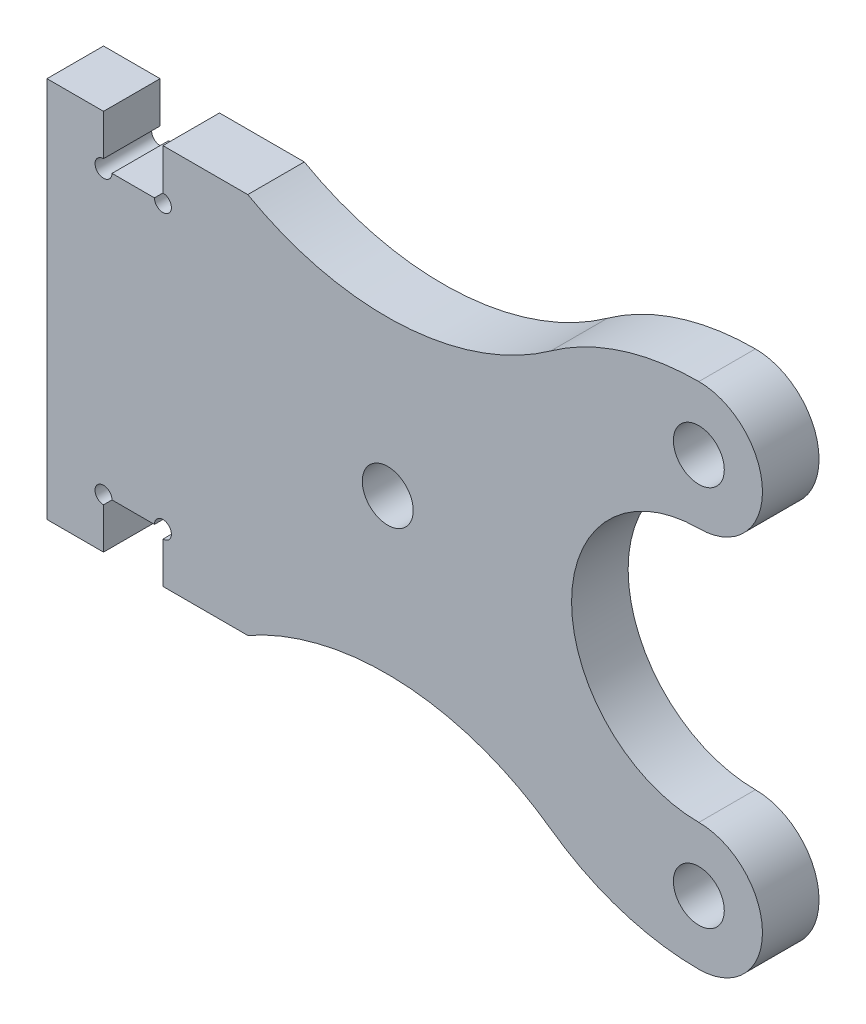
ISO-10303-21;
HEADER;
FILE_DESCRIPTION(('STEP AP214'),'2;1');
FILE_NAME('part.step','',(''),(''),'','','');
FILE_SCHEMA(('AUTOMOTIVE_DESIGN { 1 0 10303 214 1 1 1 1 }'));
ENDSEC;
DATA;
#1=APPLICATION_CONTEXT('core data for automotive mechanical design processes');
#2=APPLICATION_PROTOCOL_DEFINITION('international standard','automotive_design',2000,#1);
#3=PRODUCT_CONTEXT('',#1,'mechanical');
#4=PRODUCT('Part','Part','',(#3));
#5=PRODUCT_RELATED_PRODUCT_CATEGORY('part','',(#4));
#6=PRODUCT_DEFINITION_FORMATION('','',#4);
#7=PRODUCT_DEFINITION_CONTEXT('part definition',#1,'design');
#8=PRODUCT_DEFINITION('design','',#6,#7);
#9=PRODUCT_DEFINITION_SHAPE('','',#8);
#10=(LENGTH_UNIT() NAMED_UNIT(*) SI_UNIT(.MILLI.,.METRE.));
#11=(NAMED_UNIT(*) PLANE_ANGLE_UNIT() SI_UNIT($,.RADIAN.));
#12=(NAMED_UNIT(*) SI_UNIT($,.STERADIAN.) SOLID_ANGLE_UNIT());
#13=UNCERTAINTY_MEASURE_WITH_UNIT(LENGTH_MEASURE(1.E-05),#10,'distance_accuracy_value','');
#14=(GEOMETRIC_REPRESENTATION_CONTEXT(3) GLOBAL_UNCERTAINTY_ASSIGNED_CONTEXT((#13)) GLOBAL_UNIT_ASSIGNED_CONTEXT((#10,
#11,#12)) REPRESENTATION_CONTEXT('',''));
#15=CARTESIAN_POINT('',(0.,0.,0.));
#16=DIRECTION('',(0.,0.,1.));
#17=DIRECTION('',(1.,0.,0.));
#18=AXIS2_PLACEMENT_3D('',#15,#16,#17);
#19=CARTESIAN_POINT('',(-6.04145435688801,-15.4624152603906,2.));
#20=DIRECTION('',(0.,0.,1.));
#21=DIRECTION('',(1.,0.,0.));
#22=AXIS2_PLACEMENT_3D('',#19,#20,#21);
#23=PLANE('',#22);
#24=CARTESIAN_POINT('',(5.,6.75,2.));
#25=DIRECTION('',(0.,0.,1.));
#26=DIRECTION('',(1.,0.,0.));
#27=AXIS2_PLACEMENT_3D('',#24,#25,#26);
#28=CIRCLE('',#27,0.899999999999999);
#29=CARTESIAN_POINT('',(5.9,6.75,2.));
#30=VERTEX_POINT('',#29);
#31=EDGE_CURVE('E417',#30,#30,#28,.T.);
#32=ORIENTED_EDGE('',*,*,#31,.F.);
#33=EDGE_LOOP('',(#32));
#34=FACE_BOUND('',#33,.T.);
#35=DIRECTION('',(1.,0.,0.));
#36=VECTOR('',#35,1.);
#37=CARTESIAN_POINT('',(-13.95,-6.75,2.));
#38=LINE('',#37,#36);
#39=CARTESIAN_POINT('',(-13.95,-6.75,2.));
#40=VERTEX_POINT('',#39);
#41=CARTESIAN_POINT('',(-10.95,-6.75,2.));
#42=VERTEX_POINT('',#41);
#43=EDGE_CURVE('E258',#40,#42,#38,.T.);
#44=ORIENTED_EDGE('',*,*,#43,.T.);
#45=CARTESIAN_POINT('',(-6.04145435688801,-15.4624152603906,2.));
#46=DIRECTION('',(0.,0.,-1.));
#47=DIRECTION('',(1.,0.,0.));
#48=AXIS2_PLACEMENT_3D('',#45,#46,#47);
#49=CIRCLE('',#48,10.);
#50=CARTESIAN_POINT('',(-0.230162590104851,-7.32430196544816,2.));
#51=VERTEX_POINT('',#50);
#52=EDGE_CURVE('E136',#42,#51,#49,.T.);
#53=ORIENTED_EDGE('',*,*,#52,.T.);
#54=CARTESIAN_POINT('',(5.,0.,2.));
#55=DIRECTION('',(0.,0.,1.));
#56=DIRECTION('',(1.,0.,0.));
#57=AXIS2_PLACEMENT_3D('',#54,#55,#56);
#58=CIRCLE('',#57,9.);
#59=CARTESIAN_POINT('',(5.,-9.,2.));
#60=VERTEX_POINT('',#59);
#61=EDGE_CURVE('E315',#51,#60,#58,.T.);
#62=ORIENTED_EDGE('',*,*,#61,.T.);
#63=CARTESIAN_POINT('',(5.,-6.75,2.));
#64=DIRECTION('',(0.,0.,1.));
#65=DIRECTION('',(-1.,0.,0.));
#66=AXIS2_PLACEMENT_3D('',#63,#64,#65);
#67=CIRCLE('',#66,2.25);
#68=CARTESIAN_POINT('',(5.,-4.5,2.));
#69=VERTEX_POINT('',#68);
#70=EDGE_CURVE('E334',#60,#69,#67,.T.);
#71=ORIENTED_EDGE('',*,*,#70,.T.);
#72=CARTESIAN_POINT('',(5.,0.,2.));
#73=DIRECTION('',(0.,0.,-1.));
#74=DIRECTION('',(1.,0.,0.));
#75=AXIS2_PLACEMENT_3D('',#72,#73,#74);
#76=CIRCLE('',#75,4.5);
#77=CARTESIAN_POINT('',(5.,4.5,2.));
#78=VERTEX_POINT('',#77);
#79=EDGE_CURVE('E331',#69,#78,#76,.T.);
#80=ORIENTED_EDGE('',*,*,#79,.T.);
#81=CARTESIAN_POINT('',(5.,6.75,2.));
#82=DIRECTION('',(0.,0.,1.));
#83=DIRECTION('',(-1.,0.,0.));
#84=AXIS2_PLACEMENT_3D('',#81,#82,#83);
#85=CIRCLE('',#84,2.25);
#86=CARTESIAN_POINT('',(5.,9.,2.));
#87=VERTEX_POINT('',#86);
#88=EDGE_CURVE('E333',#78,#87,#85,.T.);
#89=ORIENTED_EDGE('',*,*,#88,.T.);
#90=CARTESIAN_POINT('',(5.,0.,2.));
#91=DIRECTION('',(0.,0.,1.));
#92=DIRECTION('',(1.,0.,0.));
#93=AXIS2_PLACEMENT_3D('',#90,#91,#92);
#94=CIRCLE('',#93,9.);
#95=CARTESIAN_POINT('',(-0.230162590104847,7.32430196544816,2.));
#96=VERTEX_POINT('',#95);
#97=EDGE_CURVE('E336',#87,#96,#94,.T.);
#98=ORIENTED_EDGE('',*,*,#97,.T.);
#99=CARTESIAN_POINT('',(-6.04145435688801,15.4624152603906,2.));
#100=DIRECTION('',(0.,0.,-1.));
#101=DIRECTION('',(1.,0.,0.));
#102=AXIS2_PLACEMENT_3D('',#99,#100,#101);
#103=CIRCLE('',#102,10.);
#104=CARTESIAN_POINT('',(-10.95,6.75,2.));
#105=VERTEX_POINT('',#104);
#106=EDGE_CURVE('E342',#96,#105,#103,.T.);
#107=ORIENTED_EDGE('',*,*,#106,.T.);
#108=DIRECTION('',(-1.,0.,0.));
#109=VECTOR('',#108,1.);
#110=CARTESIAN_POINT('',(-10.95,6.75,2.));
#111=LINE('',#110,#109);
#112=CARTESIAN_POINT('',(-13.95,6.75,2.));
#113=VERTEX_POINT('',#112);
#114=EDGE_CURVE('E344',#105,#113,#111,.T.);
#115=ORIENTED_EDGE('',*,*,#114,.T.);
#116=DIRECTION('',(0.,-1.,0.));
#117=VECTOR('',#116,1.);
#118=CARTESIAN_POINT('',(-13.95,6.75,2.));
#119=LINE('',#118,#117);
#120=CARTESIAN_POINT('',(-13.95,5.29999855515279,2.));
#121=VERTEX_POINT('',#120);
#122=EDGE_CURVE('E346',#113,#121,#119,.T.);
#123=ORIENTED_EDGE('',*,*,#122,.T.);
#124=CARTESIAN_POINT('',(-13.95,4.99999855515279,2.));
#125=DIRECTION('',(0.,0.,-1.));
#126=DIRECTION('',(1.,0.,0.));
#127=AXIS2_PLACEMENT_3D('',#124,#125,#126);
#128=CIRCLE('',#127,0.3);
#129=CARTESIAN_POINT('',(-14.25,4.99999855515279,2.));
#130=VERTEX_POINT('',#129);
#131=EDGE_CURVE('E348',#121,#130,#128,.T.);
#132=ORIENTED_EDGE('',*,*,#131,.T.);
#133=DIRECTION('',(-1.,0.,0.));
#134=VECTOR('',#133,1.);
#135=CARTESIAN_POINT('',(-14.25,4.99999855515279,2.));
#136=LINE('',#135,#134);
#137=CARTESIAN_POINT('',(-15.75,4.99999855515279,2.));
#138=VERTEX_POINT('',#137);
#139=EDGE_CURVE('E350',#130,#138,#136,.T.);
#140=ORIENTED_EDGE('',*,*,#139,.T.);
#141=CARTESIAN_POINT('',(-16.05,4.99999855515279,2.));
#142=DIRECTION('',(0.,0.,-1.));
#143=DIRECTION('',(1.,0.,0.));
#144=AXIS2_PLACEMENT_3D('',#141,#142,#143);
#145=CIRCLE('',#144,0.300000000000001);
#146=CARTESIAN_POINT('',(-16.05,5.29999855515279,2.));
#147=VERTEX_POINT('',#146);
#148=EDGE_CURVE('E352',#138,#147,#145,.T.);
#149=ORIENTED_EDGE('',*,*,#148,.T.);
#150=DIRECTION('',(0.,1.,0.));
#151=VECTOR('',#150,1.);
#152=CARTESIAN_POINT('',(-16.05,5.29999855515279,2.));
#153=LINE('',#152,#151);
#154=CARTESIAN_POINT('',(-16.05,6.75,2.));
#155=VERTEX_POINT('',#154);
#156=EDGE_CURVE('E354',#147,#155,#153,.T.);
#157=ORIENTED_EDGE('',*,*,#156,.T.);
#158=DIRECTION('',(-1.,0.,0.));
#159=VECTOR('',#158,1.);
#160=CARTESIAN_POINT('',(-16.05,6.75,2.));
#161=LINE('',#160,#159);
#162=CARTESIAN_POINT('',(-18.05,6.75,2.));
#163=VERTEX_POINT('',#162);
#164=EDGE_CURVE('E356',#155,#163,#161,.T.);
#165=ORIENTED_EDGE('',*,*,#164,.T.);
#166=DIRECTION('',(0.,-1.,0.));
#167=VECTOR('',#166,1.);
#168=CARTESIAN_POINT('',(-18.05,6.75,2.));
#169=LINE('',#168,#167);
#170=CARTESIAN_POINT('',(-18.05,-6.75,2.));
#171=VERTEX_POINT('',#170);
#172=EDGE_CURVE('E358',#163,#171,#169,.T.);
#173=ORIENTED_EDGE('',*,*,#172,.T.);
#174=DIRECTION('',(1.,0.,0.));
#175=VECTOR('',#174,1.);
#176=CARTESIAN_POINT('',(-18.05,-6.75,2.));
#177=LINE('',#176,#175);
#178=CARTESIAN_POINT('',(-16.05,-6.75,2.));
#179=VERTEX_POINT('',#178);
#180=EDGE_CURVE('E360',#171,#179,#177,.T.);
#181=ORIENTED_EDGE('',*,*,#180,.T.);
#182=DIRECTION('',(0.,1.,0.));
#183=VECTOR('',#182,1.);
#184=CARTESIAN_POINT('',(-16.05,-6.75,2.));
#185=LINE('',#184,#183);
#186=CARTESIAN_POINT('',(-16.05,-5.29999855515279,2.));
#187=VERTEX_POINT('',#186);
#188=EDGE_CURVE('E362',#179,#187,#185,.T.);
#189=ORIENTED_EDGE('',*,*,#188,.T.);
#190=CARTESIAN_POINT('',(-16.05,-4.99999855515279,2.));
#191=DIRECTION('',(0.,0.,-1.));
#192=DIRECTION('',(1.,0.,0.));
#193=AXIS2_PLACEMENT_3D('',#190,#191,#192);
#194=CIRCLE('',#193,0.3);
#195=CARTESIAN_POINT('',(-15.75,-4.99999855515279,2.));
#196=VERTEX_POINT('',#195);
#197=EDGE_CURVE('E197',#187,#196,#194,.T.);
#198=ORIENTED_EDGE('',*,*,#197,.T.);
#199=DIRECTION('',(1.,0.,0.));
#200=VECTOR('',#199,1.);
#201=CARTESIAN_POINT('',(-15.75,-4.99999855515279,2.));
#202=LINE('',#201,#200);
#203=CARTESIAN_POINT('',(-14.25,-4.99999855515279,2.));
#204=VERTEX_POINT('',#203);
#205=EDGE_CURVE('E191',#196,#204,#202,.T.);
#206=ORIENTED_EDGE('',*,*,#205,.T.);
#207=CARTESIAN_POINT('',(-13.95,-4.99999855515279,2.));
#208=DIRECTION('',(0.,0.,-1.));
#209=DIRECTION('',(1.,0.,0.));
#210=AXIS2_PLACEMENT_3D('',#207,#208,#209);
#211=CIRCLE('',#210,0.3);
#212=CARTESIAN_POINT('',(-13.95,-5.29999855515279,2.));
#213=VERTEX_POINT('',#212);
#214=EDGE_CURVE('E195',#204,#213,#211,.T.);
#215=ORIENTED_EDGE('',*,*,#214,.T.);
#216=DIRECTION('',(0.,-1.,0.));
#217=VECTOR('',#216,1.);
#218=CARTESIAN_POINT('',(-13.95,-5.29999855515279,2.));
#219=LINE('',#218,#217);
#220=EDGE_CURVE('E51',#213,#40,#219,.T.);
#221=ORIENTED_EDGE('',*,*,#220,.T.);
#222=EDGE_LOOP('',(#44,#53,#62,#71,#80,#89,#98,#107,#115,#123,#132,#140,#149,#157,#165,#173,
#181,#189,#198,#206,#215,#221));
#223=FACE_BOUND('',#222,.T.);
#224=CARTESIAN_POINT('',(-6.,0.,2.));
#225=DIRECTION('',(0.,0.,1.));
#226=DIRECTION('',(1.,0.,0.));
#227=AXIS2_PLACEMENT_3D('',#224,#225,#226);
#228=CIRCLE('',#227,0.899999999999999);
#229=CARTESIAN_POINT('',(-5.1,0.,2.));
#230=VERTEX_POINT('',#229);
#231=EDGE_CURVE('E219',#230,#230,#228,.T.);
#232=ORIENTED_EDGE('',*,*,#231,.F.);
#233=EDGE_LOOP('',(#232));
#234=FACE_BOUND('',#233,.T.);
#235=CARTESIAN_POINT('',(5.,-6.75,2.));
#236=DIRECTION('',(0.,0.,1.));
#237=DIRECTION('',(1.,0.,0.));
#238=AXIS2_PLACEMENT_3D('',#235,#236,#237);
#239=CIRCLE('',#238,0.899999999999999);
#240=CARTESIAN_POINT('',(5.9,-6.75,2.));
#241=VERTEX_POINT('',#240);
#242=EDGE_CURVE('E408',#241,#241,#239,.T.);
#243=ORIENTED_EDGE('',*,*,#242,.F.);
#244=EDGE_LOOP('',(#243));
#245=FACE_BOUND('',#244,.T.);
#246=ADVANCED_FACE('F34',(#34,#223,#234,#245),#23,.T.);
#247=CARTESIAN_POINT('',(-6.04145435688801,-15.4624152603906,0.));
#248=DIRECTION('',(0.,0.,1.));
#249=DIRECTION('',(1.,0.,0.));
#250=AXIS2_PLACEMENT_3D('',#247,#248,#249);
#251=PLANE('',#250);
#252=DIRECTION('',(1.,0.,0.));
#253=VECTOR('',#252,1.);
#254=CARTESIAN_POINT('',(-13.95,-6.75,0.));
#255=LINE('',#254,#253);
#256=CARTESIAN_POINT('',(-13.95,-6.75,0.));
#257=VERTEX_POINT('',#256);
#258=CARTESIAN_POINT('',(-10.95,-6.75,0.));
#259=VERTEX_POINT('',#258);
#260=EDGE_CURVE('E215',#257,#259,#255,.T.);
#261=ORIENTED_EDGE('',*,*,#260,.F.);
#262=DIRECTION('',(0.,-1.,0.));
#263=VECTOR('',#262,1.);
#264=CARTESIAN_POINT('',(-13.95,-5.29999855515279,0.));
#265=LINE('',#264,#263);
#266=CARTESIAN_POINT('',(-13.95,-5.29999855515279,0.));
#267=VERTEX_POINT('',#266);
#268=EDGE_CURVE('E128',#267,#257,#265,.T.);
#269=ORIENTED_EDGE('',*,*,#268,.F.);
#270=CARTESIAN_POINT('',(-13.95,-4.99999855515279,0.));
#271=DIRECTION('',(0.,0.,-1.));
#272=DIRECTION('',(1.,0.,0.));
#273=AXIS2_PLACEMENT_3D('',#270,#271,#272);
#274=CIRCLE('',#273,0.3);
#275=CARTESIAN_POINT('',(-14.25,-4.99999855515279,0.));
#276=VERTEX_POINT('',#275);
#277=EDGE_CURVE('E122',#276,#267,#274,.T.);
#278=ORIENTED_EDGE('',*,*,#277,.F.);
#279=DIRECTION('',(1.,0.,0.));
#280=VECTOR('',#279,1.);
#281=CARTESIAN_POINT('',(-15.75,-4.99999855515279,0.));
#282=LINE('',#281,#280);
#283=CARTESIAN_POINT('',(-15.75,-4.99999855515279,0.));
#284=VERTEX_POINT('',#283);
#285=EDGE_CURVE('E205',#284,#276,#282,.T.);
#286=ORIENTED_EDGE('',*,*,#285,.F.);
#287=CARTESIAN_POINT('',(-16.05,-4.99999855515279,0.));
#288=DIRECTION('',(0.,0.,-1.));
#289=DIRECTION('',(1.,0.,0.));
#290=AXIS2_PLACEMENT_3D('',#287,#288,#289);
#291=CIRCLE('',#290,0.3);
#292=CARTESIAN_POINT('',(-16.05,-5.29999855515279,0.));
#293=VERTEX_POINT('',#292);
#294=EDGE_CURVE('E253',#293,#284,#291,.T.);
#295=ORIENTED_EDGE('',*,*,#294,.F.);
#296=DIRECTION('',(0.,1.,0.));
#297=VECTOR('',#296,1.);
#298=CARTESIAN_POINT('',(-16.05,-6.75,0.));
#299=LINE('',#298,#297);
#300=CARTESIAN_POINT('',(-16.05,-6.75,0.));
#301=VERTEX_POINT('',#300);
#302=EDGE_CURVE('E251',#301,#293,#299,.T.);
#303=ORIENTED_EDGE('',*,*,#302,.F.);
#304=DIRECTION('',(1.,0.,0.));
#305=VECTOR('',#304,1.);
#306=CARTESIAN_POINT('',(-18.05,-6.75,0.));
#307=LINE('',#306,#305);
#308=CARTESIAN_POINT('',(-18.05,-6.75,0.));
#309=VERTEX_POINT('',#308);
#310=EDGE_CURVE('E249',#309,#301,#307,.T.);
#311=ORIENTED_EDGE('',*,*,#310,.F.);
#312=DIRECTION('',(0.,-1.,0.));
#313=VECTOR('',#312,1.);
#314=CARTESIAN_POINT('',(-18.05,6.75,0.));
#315=LINE('',#314,#313);
#316=CARTESIAN_POINT('',(-18.05,6.75,0.));
#317=VERTEX_POINT('',#316);
#318=EDGE_CURVE('E247',#317,#309,#315,.T.);
#319=ORIENTED_EDGE('',*,*,#318,.F.);
#320=DIRECTION('',(-1.,0.,0.));
#321=VECTOR('',#320,1.);
#322=CARTESIAN_POINT('',(-16.05,6.75,0.));
#323=LINE('',#322,#321);
#324=CARTESIAN_POINT('',(-16.05,6.75,0.));
#325=VERTEX_POINT('',#324);
#326=EDGE_CURVE('E245',#325,#317,#323,.T.);
#327=ORIENTED_EDGE('',*,*,#326,.F.);
#328=DIRECTION('',(0.,1.,0.));
#329=VECTOR('',#328,1.);
#330=CARTESIAN_POINT('',(-16.05,5.29999855515279,0.));
#331=LINE('',#330,#329);
#332=CARTESIAN_POINT('',(-16.05,5.29999855515279,0.));
#333=VERTEX_POINT('',#332);
#334=EDGE_CURVE('E243',#333,#325,#331,.T.);
#335=ORIENTED_EDGE('',*,*,#334,.F.);
#336=CARTESIAN_POINT('',(-16.05,4.99999855515279,0.));
#337=DIRECTION('',(0.,0.,-1.));
#338=DIRECTION('',(1.,0.,0.));
#339=AXIS2_PLACEMENT_3D('',#336,#337,#338);
#340=CIRCLE('',#339,0.300000000000001);
#341=CARTESIAN_POINT('',(-15.75,4.99999855515279,0.));
#342=VERTEX_POINT('',#341);
#343=EDGE_CURVE('E241',#342,#333,#340,.T.);
#344=ORIENTED_EDGE('',*,*,#343,.F.);
#345=DIRECTION('',(-1.,0.,0.));
#346=VECTOR('',#345,1.);
#347=CARTESIAN_POINT('',(-14.25,4.99999855515279,0.));
#348=LINE('',#347,#346);
#349=CARTESIAN_POINT('',(-14.25,4.99999855515279,0.));
#350=VERTEX_POINT('',#349);
#351=EDGE_CURVE('E239',#350,#342,#348,.T.);
#352=ORIENTED_EDGE('',*,*,#351,.F.);
#353=CARTESIAN_POINT('',(-13.95,4.99999855515279,0.));
#354=DIRECTION('',(0.,0.,-1.));
#355=DIRECTION('',(1.,0.,0.));
#356=AXIS2_PLACEMENT_3D('',#353,#354,#355);
#357=CIRCLE('',#356,0.3);
#358=CARTESIAN_POINT('',(-13.95,5.29999855515279,0.));
#359=VERTEX_POINT('',#358);
#360=EDGE_CURVE('E237',#359,#350,#357,.T.);
#361=ORIENTED_EDGE('',*,*,#360,.F.);
#362=DIRECTION('',(0.,-1.,0.));
#363=VECTOR('',#362,1.);
#364=CARTESIAN_POINT('',(-13.95,6.75,0.));
#365=LINE('',#364,#363);
#366=CARTESIAN_POINT('',(-13.95,6.75,0.));
#367=VERTEX_POINT('',#366);
#368=EDGE_CURVE('E235',#367,#359,#365,.T.);
#369=ORIENTED_EDGE('',*,*,#368,.F.);
#370=DIRECTION('',(-1.,0.,0.));
#371=VECTOR('',#370,1.);
#372=CARTESIAN_POINT('',(-10.95,6.75,0.));
#373=LINE('',#372,#371);
#374=CARTESIAN_POINT('',(-10.95,6.75,0.));
#375=VERTEX_POINT('',#374);
#376=EDGE_CURVE('E233',#375,#367,#373,.T.);
#377=ORIENTED_EDGE('',*,*,#376,.F.);
#378=CARTESIAN_POINT('',(-6.04145435688801,15.4624152603906,0.));
#379=DIRECTION('',(0.,0.,-1.));
#380=DIRECTION('',(1.,0.,0.));
#381=AXIS2_PLACEMENT_3D('',#378,#379,#380);
#382=CIRCLE('',#381,10.);
#383=CARTESIAN_POINT('',(-0.230162590104847,7.32430196544816,0.));
#384=VERTEX_POINT('',#383);
#385=EDGE_CURVE('E231',#384,#375,#382,.T.);
#386=ORIENTED_EDGE('',*,*,#385,.F.);
#387=CARTESIAN_POINT('',(5.,0.,0.));
#388=DIRECTION('',(0.,0.,1.));
#389=DIRECTION('',(1.,0.,0.));
#390=AXIS2_PLACEMENT_3D('',#387,#388,#389);
#391=CIRCLE('',#390,9.);
#392=CARTESIAN_POINT('',(5.,9.,0.));
#393=VERTEX_POINT('',#392);
#394=EDGE_CURVE('E229',#393,#384,#391,.T.);
#395=ORIENTED_EDGE('',*,*,#394,.F.);
#396=CARTESIAN_POINT('',(5.,6.75,0.));
#397=DIRECTION('',(0.,0.,1.));
#398=DIRECTION('',(-1.,0.,0.));
#399=AXIS2_PLACEMENT_3D('',#396,#397,#398);
#400=CIRCLE('',#399,2.25);
#401=CARTESIAN_POINT('',(5.,4.5,0.));
#402=VERTEX_POINT('',#401);
#403=EDGE_CURVE('E227',#402,#393,#400,.T.);
#404=ORIENTED_EDGE('',*,*,#403,.F.);
#405=CARTESIAN_POINT('',(5.,0.,0.));
#406=DIRECTION('',(0.,0.,-1.));
#407=DIRECTION('',(1.,0.,0.));
#408=AXIS2_PLACEMENT_3D('',#405,#406,#407);
#409=CIRCLE('',#408,4.5);
#410=CARTESIAN_POINT('',(5.,-4.5,0.));
#411=VERTEX_POINT('',#410);
#412=EDGE_CURVE('E225',#411,#402,#409,.T.);
#413=ORIENTED_EDGE('',*,*,#412,.F.);
#414=CARTESIAN_POINT('',(5.,-6.75,0.));
#415=DIRECTION('',(0.,0.,1.));
#416=DIRECTION('',(-1.,0.,0.));
#417=AXIS2_PLACEMENT_3D('',#414,#415,#416);
#418=CIRCLE('',#417,2.25);
#419=CARTESIAN_POINT('',(5.,-9.,0.));
#420=VERTEX_POINT('',#419);
#421=EDGE_CURVE('E223',#420,#411,#418,.T.);
#422=ORIENTED_EDGE('',*,*,#421,.F.);
#423=CARTESIAN_POINT('',(5.,0.,0.));
#424=DIRECTION('',(0.,0.,1.));
#425=DIRECTION('',(1.,0.,0.));
#426=AXIS2_PLACEMENT_3D('',#423,#424,#425);
#427=CIRCLE('',#426,9.);
#428=CARTESIAN_POINT('',(-0.230162590104851,-7.32430196544816,0.));
#429=VERTEX_POINT('',#428);
#430=EDGE_CURVE('E221',#429,#420,#427,.T.);
#431=ORIENTED_EDGE('',*,*,#430,.F.);
#432=CARTESIAN_POINT('',(-6.04145435688801,-15.4624152603906,0.));
#433=DIRECTION('',(0.,0.,-1.));
#434=DIRECTION('',(1.,0.,0.));
#435=AXIS2_PLACEMENT_3D('',#432,#433,#434);
#436=CIRCLE('',#435,10.);
#437=EDGE_CURVE('E218',#259,#429,#436,.T.);
#438=ORIENTED_EDGE('',*,*,#437,.F.);
#439=EDGE_LOOP('',(#261,#269,#278,#286,#295,#303,#311,#319,#327,#335,#344,#352,#361,#369,#377,
#386,#395,#404,#413,#422,#431,#438));
#440=FACE_BOUND('',#439,.T.);
#441=CARTESIAN_POINT('',(-6.,0.,0.));
#442=DIRECTION('',(0.,0.,1.));
#443=DIRECTION('',(1.,0.,0.));
#444=AXIS2_PLACEMENT_3D('',#441,#442,#443);
#445=CIRCLE('',#444,0.899999999999999);
#446=CARTESIAN_POINT('',(-5.1,0.,0.));
#447=VERTEX_POINT('',#446);
#448=EDGE_CURVE('E420',#447,#447,#445,.T.);
#449=ORIENTED_EDGE('',*,*,#448,.T.);
#450=EDGE_LOOP('',(#449));
#451=FACE_BOUND('',#450,.T.);
#452=CARTESIAN_POINT('',(5.,6.75,0.));
#453=DIRECTION('',(0.,0.,1.));
#454=DIRECTION('',(1.,0.,0.));
#455=AXIS2_PLACEMENT_3D('',#452,#453,#454);
#456=CIRCLE('',#455,0.899999999999999);
#457=CARTESIAN_POINT('',(5.9,6.75,0.));
#458=VERTEX_POINT('',#457);
#459=EDGE_CURVE('E414',#458,#458,#456,.T.);
#460=ORIENTED_EDGE('',*,*,#459,.T.);
#461=EDGE_LOOP('',(#460));
#462=FACE_BOUND('',#461,.T.);
#463=CARTESIAN_POINT('',(5.,-6.75,0.));
#464=DIRECTION('',(0.,0.,1.));
#465=DIRECTION('',(1.,0.,0.));
#466=AXIS2_PLACEMENT_3D('',#463,#464,#465);
#467=CIRCLE('',#466,0.899999999999999);
#468=CARTESIAN_POINT('',(5.9,-6.75,0.));
#469=VERTEX_POINT('',#468);
#470=EDGE_CURVE('E411',#469,#469,#467,.T.);
#471=ORIENTED_EDGE('',*,*,#470,.T.);
#472=EDGE_LOOP('',(#471));
#473=FACE_BOUND('',#472,.T.);
#474=ADVANCED_FACE('F319',(#440,#451,#462,#473),#251,.F.);
#475=CARTESIAN_POINT('',(-13.95,-6.75,2.));
#476=DIRECTION('',(0.,1.,0.));
#477=DIRECTION('',(-1.,0.,0.));
#478=AXIS2_PLACEMENT_3D('',#475,#476,#477);
#479=PLANE('',#478);
#480=ORIENTED_EDGE('',*,*,#260,.T.);
#481=DIRECTION('',(0.,0.,-1.));
#482=VECTOR('',#481,1.);
#483=CARTESIAN_POINT('',(-10.95,-6.75,2.));
#484=LINE('',#483,#482);
#485=EDGE_CURVE('E11',#42,#259,#484,.T.);
#486=ORIENTED_EDGE('',*,*,#485,.F.);
#487=ORIENTED_EDGE('',*,*,#43,.F.);
#488=DIRECTION('',(0.,0.,-1.));
#489=VECTOR('',#488,1.);
#490=CARTESIAN_POINT('',(-13.95,-6.75,2.));
#491=LINE('',#490,#489);
#492=EDGE_CURVE('E211',#40,#257,#491,.T.);
#493=ORIENTED_EDGE('',*,*,#492,.T.);
#494=EDGE_LOOP('',(#480,#486,#487,#493));
#495=FACE_BOUND('',#494,.T.);
#496=ADVANCED_FACE('F36',(#495),#479,.F.);
#497=CARTESIAN_POINT('',(-6.04145435688801,-15.4624152603906,2.));
#498=DIRECTION('',(0.,0.,-1.));
#499=DIRECTION('',(-1.,0.,0.));
#500=AXIS2_PLACEMENT_3D('',#497,#498,#499);
#501=CYLINDRICAL_SURFACE('',#500,10.);
#502=ORIENTED_EDGE('',*,*,#437,.T.);
#503=DIRECTION('',(0.,0.,-1.));
#504=VECTOR('',#503,1.);
#505=CARTESIAN_POINT('',(-0.230162590104851,-7.32430196544816,2.));
#506=LINE('',#505,#504);
#507=EDGE_CURVE('E43',#51,#429,#506,.T.);
#508=ORIENTED_EDGE('',*,*,#507,.F.);
#509=ORIENTED_EDGE('',*,*,#52,.F.);
#510=ORIENTED_EDGE('',*,*,#485,.T.);
#511=EDGE_LOOP('',(#502,#508,#509,#510));
#512=FACE_BOUND('',#511,.T.);
#513=ADVANCED_FACE('F622',(#512),#501,.F.);
#514=CARTESIAN_POINT('',(5.,0.,2.));
#515=DIRECTION('',(0.,0.,-1.));
#516=DIRECTION('',(-1.,0.,0.));
#517=AXIS2_PLACEMENT_3D('',#514,#515,#516);
#518=CYLINDRICAL_SURFACE('',#517,9.);
#519=ORIENTED_EDGE('',*,*,#430,.T.);
#520=DIRECTION('',(0.,0.,-1.));
#521=VECTOR('',#520,1.);
#522=CARTESIAN_POINT('',(5.,-9.,2.));
#523=LINE('',#522,#521);
#524=EDGE_CURVE('E307',#60,#420,#523,.T.);
#525=ORIENTED_EDGE('',*,*,#524,.F.);
#526=ORIENTED_EDGE('',*,*,#61,.F.);
#527=ORIENTED_EDGE('',*,*,#507,.T.);
#528=EDGE_LOOP('',(#519,#525,#526,#527));
#529=FACE_BOUND('',#528,.T.);
#530=ADVANCED_FACE('F313',(#529),#518,.T.);
#531=CARTESIAN_POINT('',(5.,-6.75,2.));
#532=DIRECTION('',(0.,0.,-1.));
#533=DIRECTION('',(-1.,0.,0.));
#534=AXIS2_PLACEMENT_3D('',#531,#532,#533);
#535=CYLINDRICAL_SURFACE('',#534,2.25);
#536=ORIENTED_EDGE('',*,*,#421,.T.);
#537=DIRECTION('',(0.,0.,-1.));
#538=VECTOR('',#537,1.);
#539=CARTESIAN_POINT('',(5.,-4.5,2.));
#540=LINE('',#539,#538);
#541=EDGE_CURVE('E304',#69,#411,#540,.T.);
#542=ORIENTED_EDGE('',*,*,#541,.F.);
#543=ORIENTED_EDGE('',*,*,#70,.F.);
#544=ORIENTED_EDGE('',*,*,#524,.T.);
#545=EDGE_LOOP('',(#536,#542,#543,#544));
#546=FACE_BOUND('',#545,.T.);
#547=ADVANCED_FACE('F325',(#546),#535,.T.);
#548=CARTESIAN_POINT('',(5.,0.,2.));
#549=DIRECTION('',(0.,0.,-1.));
#550=DIRECTION('',(-1.,0.,0.));
#551=AXIS2_PLACEMENT_3D('',#548,#549,#550);
#552=CYLINDRICAL_SURFACE('',#551,4.5);
#553=ORIENTED_EDGE('',*,*,#412,.T.);
#554=DIRECTION('',(0.,0.,-1.));
#555=VECTOR('',#554,1.);
#556=CARTESIAN_POINT('',(5.,4.5,2.));
#557=LINE('',#556,#555);
#558=EDGE_CURVE('E301',#78,#402,#557,.T.);
#559=ORIENTED_EDGE('',*,*,#558,.F.);
#560=ORIENTED_EDGE('',*,*,#79,.F.);
#561=ORIENTED_EDGE('',*,*,#541,.T.);
#562=EDGE_LOOP('',(#553,#559,#560,#561));
#563=FACE_BOUND('',#562,.T.);
#564=ADVANCED_FACE('F329',(#563),#552,.F.);
#565=CARTESIAN_POINT('',(5.,6.75,2.));
#566=DIRECTION('',(0.,0.,-1.));
#567=DIRECTION('',(-1.,0.,0.));
#568=AXIS2_PLACEMENT_3D('',#565,#566,#567);
#569=CYLINDRICAL_SURFACE('',#568,2.25);
#570=ORIENTED_EDGE('',*,*,#403,.T.);
#571=DIRECTION('',(0.,0.,-1.));
#572=VECTOR('',#571,1.);
#573=CARTESIAN_POINT('',(5.,9.,2.));
#574=LINE('',#573,#572);
#575=EDGE_CURVE('E298',#87,#393,#574,.T.);
#576=ORIENTED_EDGE('',*,*,#575,.F.);
#577=ORIENTED_EDGE('',*,*,#88,.F.);
#578=ORIENTED_EDGE('',*,*,#558,.T.);
#579=EDGE_LOOP('',(#570,#576,#577,#578));
#580=FACE_BOUND('',#579,.T.);
#581=ADVANCED_FACE('F587',(#580),#569,.T.);
#582=CARTESIAN_POINT('',(5.,0.,2.));
#583=DIRECTION('',(0.,0.,-1.));
#584=DIRECTION('',(-1.,0.,0.));
#585=AXIS2_PLACEMENT_3D('',#582,#583,#584);
#586=CYLINDRICAL_SURFACE('',#585,9.);
#587=ORIENTED_EDGE('',*,*,#394,.T.);
#588=DIRECTION('',(0.,0.,-1.));
#589=VECTOR('',#588,1.);
#590=CARTESIAN_POINT('',(-0.230162590104847,7.32430196544816,2.));
#591=LINE('',#590,#589);
#592=EDGE_CURVE('E295',#96,#384,#591,.T.);
#593=ORIENTED_EDGE('',*,*,#592,.F.);
#594=ORIENTED_EDGE('',*,*,#97,.F.);
#595=ORIENTED_EDGE('',*,*,#575,.T.);
#596=EDGE_LOOP('',(#587,#593,#594,#595));
#597=FACE_BOUND('',#596,.T.);
#598=ADVANCED_FACE('F577',(#597),#586,.T.);
#599=CARTESIAN_POINT('',(-6.04145435688801,15.4624152603906,2.));
#600=DIRECTION('',(0.,0.,-1.));
#601=DIRECTION('',(-1.,0.,0.));
#602=AXIS2_PLACEMENT_3D('',#599,#600,#601);
#603=CYLINDRICAL_SURFACE('',#602,10.);
#604=ORIENTED_EDGE('',*,*,#385,.T.);
#605=DIRECTION('',(0.,0.,-1.));
#606=VECTOR('',#605,1.);
#607=CARTESIAN_POINT('',(-10.95,6.75,2.));
#608=LINE('',#607,#606);
#609=EDGE_CURVE('E292',#105,#375,#608,.T.);
#610=ORIENTED_EDGE('',*,*,#609,.F.);
#611=ORIENTED_EDGE('',*,*,#106,.F.);
#612=ORIENTED_EDGE('',*,*,#592,.T.);
#613=EDGE_LOOP('',(#604,#610,#611,#612));
#614=FACE_BOUND('',#613,.T.);
#615=ADVANCED_FACE('F567',(#614),#603,.F.);
#616=CARTESIAN_POINT('',(-10.95,6.75,2.));
#617=DIRECTION('',(0.,-1.,0.));
#618=DIRECTION('',(1.,0.,0.));
#619=AXIS2_PLACEMENT_3D('',#616,#617,#618);
#620=PLANE('',#619);
#621=ORIENTED_EDGE('',*,*,#376,.T.);
#622=DIRECTION('',(0.,0.,-1.));
#623=VECTOR('',#622,1.);
#624=CARTESIAN_POINT('',(-13.95,6.75,2.));
#625=LINE('',#624,#623);
#626=EDGE_CURVE('E289',#113,#367,#625,.T.);
#627=ORIENTED_EDGE('',*,*,#626,.F.);
#628=ORIENTED_EDGE('',*,*,#114,.F.);
#629=ORIENTED_EDGE('',*,*,#609,.T.);
#630=EDGE_LOOP('',(#621,#627,#628,#629));
#631=FACE_BOUND('',#630,.T.);
#632=ADVANCED_FACE('F557',(#631),#620,.F.);
#633=CARTESIAN_POINT('',(-13.95,6.75,2.));
#634=DIRECTION('',(1.,0.,0.));
#635=DIRECTION('',(0.,1.,0.));
#636=AXIS2_PLACEMENT_3D('',#633,#634,#635);
#637=PLANE('',#636);
#638=ORIENTED_EDGE('',*,*,#368,.T.);
#639=DIRECTION('',(0.,0.,-1.));
#640=VECTOR('',#639,1.);
#641=CARTESIAN_POINT('',(-13.95,5.29999855515279,2.));
#642=LINE('',#641,#640);
#643=EDGE_CURVE('E286',#121,#359,#642,.T.);
#644=ORIENTED_EDGE('',*,*,#643,.F.);
#645=ORIENTED_EDGE('',*,*,#122,.F.);
#646=ORIENTED_EDGE('',*,*,#626,.T.);
#647=EDGE_LOOP('',(#638,#644,#645,#646));
#648=FACE_BOUND('',#647,.T.);
#649=ADVANCED_FACE('F547',(#648),#637,.F.);
#650=CARTESIAN_POINT('',(-13.95,4.99999855515279,2.));
#651=DIRECTION('',(0.,0.,-1.));
#652=DIRECTION('',(-1.,0.,0.));
#653=AXIS2_PLACEMENT_3D('',#650,#651,#652);
#654=CYLINDRICAL_SURFACE('',#653,0.3);
#655=ORIENTED_EDGE('',*,*,#360,.T.);
#656=DIRECTION('',(0.,0.,-1.));
#657=VECTOR('',#656,1.);
#658=CARTESIAN_POINT('',(-14.25,4.99999855515279,2.));
#659=LINE('',#658,#657);
#660=EDGE_CURVE('E283',#130,#350,#659,.T.);
#661=ORIENTED_EDGE('',*,*,#660,.F.);
#662=ORIENTED_EDGE('',*,*,#131,.F.);
#663=ORIENTED_EDGE('',*,*,#643,.T.);
#664=EDGE_LOOP('',(#655,#661,#662,#663));
#665=FACE_BOUND('',#664,.T.);
#666=ADVANCED_FACE('F537',(#665),#654,.F.);
#667=CARTESIAN_POINT('',(-14.25,4.99999855515279,2.));
#668=DIRECTION('',(0.,-1.,0.));
#669=DIRECTION('',(0.,0.,-1.));
#670=AXIS2_PLACEMENT_3D('',#667,#668,#669);
#671=PLANE('',#670);
#672=ORIENTED_EDGE('',*,*,#351,.T.);
#673=DIRECTION('',(0.,0.,-1.));
#674=VECTOR('',#673,1.);
#675=CARTESIAN_POINT('',(-15.75,4.99999855515279,2.));
#676=LINE('',#675,#674);
#677=EDGE_CURVE('E280',#138,#342,#676,.T.);
#678=ORIENTED_EDGE('',*,*,#677,.F.);
#679=ORIENTED_EDGE('',*,*,#139,.F.);
#680=ORIENTED_EDGE('',*,*,#660,.T.);
#681=EDGE_LOOP('',(#672,#678,#679,#680));
#682=FACE_BOUND('',#681,.T.);
#683=ADVANCED_FACE('F527',(#682),#671,.F.);
#684=CARTESIAN_POINT('',(-16.05,4.99999855515279,2.));
#685=DIRECTION('',(0.,0.,-1.));
#686=DIRECTION('',(-1.,0.,0.));
#687=AXIS2_PLACEMENT_3D('',#684,#685,#686);
#688=CYLINDRICAL_SURFACE('',#687,0.300000000000001);
#689=ORIENTED_EDGE('',*,*,#343,.T.);
#690=DIRECTION('',(0.,0.,-1.));
#691=VECTOR('',#690,1.);
#692=CARTESIAN_POINT('',(-16.05,5.29999855515279,2.));
#693=LINE('',#692,#691);
#694=EDGE_CURVE('E277',#147,#333,#693,.T.);
#695=ORIENTED_EDGE('',*,*,#694,.F.);
#696=ORIENTED_EDGE('',*,*,#148,.F.);
#697=ORIENTED_EDGE('',*,*,#677,.T.);
#698=EDGE_LOOP('',(#689,#695,#696,#697));
#699=FACE_BOUND('',#698,.T.);
#700=ADVANCED_FACE('F517',(#699),#688,.F.);
#701=CARTESIAN_POINT('',(-16.05,5.29999855515279,2.));
#702=DIRECTION('',(-1.,0.,0.));
#703=DIRECTION('',(0.,0.,1.));
#704=AXIS2_PLACEMENT_3D('',#701,#702,#703);
#705=PLANE('',#704);
#706=ORIENTED_EDGE('',*,*,#334,.T.);
#707=DIRECTION('',(0.,0.,-1.));
#708=VECTOR('',#707,1.);
#709=CARTESIAN_POINT('',(-16.05,6.75,2.));
#710=LINE('',#709,#708);
#711=EDGE_CURVE('E274',#155,#325,#710,.T.);
#712=ORIENTED_EDGE('',*,*,#711,.F.);
#713=ORIENTED_EDGE('',*,*,#156,.F.);
#714=ORIENTED_EDGE('',*,*,#694,.T.);
#715=EDGE_LOOP('',(#706,#712,#713,#714));
#716=FACE_BOUND('',#715,.T.);
#717=ADVANCED_FACE('F507',(#716),#705,.F.);
#718=CARTESIAN_POINT('',(-16.05,6.75,2.));
#719=DIRECTION('',(0.,-1.,0.));
#720=DIRECTION('',(0.,0.,-1.));
#721=AXIS2_PLACEMENT_3D('',#718,#719,#720);
#722=PLANE('',#721);
#723=ORIENTED_EDGE('',*,*,#326,.T.);
#724=DIRECTION('',(0.,0.,-1.));
#725=VECTOR('',#724,1.);
#726=CARTESIAN_POINT('',(-18.05,6.75,2.));
#727=LINE('',#726,#725);
#728=EDGE_CURVE('E271',#163,#317,#727,.T.);
#729=ORIENTED_EDGE('',*,*,#728,.F.);
#730=ORIENTED_EDGE('',*,*,#164,.F.);
#731=ORIENTED_EDGE('',*,*,#711,.T.);
#732=EDGE_LOOP('',(#723,#729,#730,#731));
#733=FACE_BOUND('',#732,.T.);
#734=ADVANCED_FACE('F497',(#733),#722,.F.);
#735=CARTESIAN_POINT('',(-18.05,6.75,2.));
#736=DIRECTION('',(1.,0.,0.));
#737=DIRECTION('',(0.,0.,-1.));
#738=AXIS2_PLACEMENT_3D('',#735,#736,#737);
#739=PLANE('',#738);
#740=ORIENTED_EDGE('',*,*,#318,.T.);
#741=DIRECTION('',(0.,0.,-1.));
#742=VECTOR('',#741,1.);
#743=CARTESIAN_POINT('',(-18.05,-6.75,2.));
#744=LINE('',#743,#742);
#745=EDGE_CURVE('E268',#171,#309,#744,.T.);
#746=ORIENTED_EDGE('',*,*,#745,.F.);
#747=ORIENTED_EDGE('',*,*,#172,.F.);
#748=ORIENTED_EDGE('',*,*,#728,.T.);
#749=EDGE_LOOP('',(#740,#746,#747,#748));
#750=FACE_BOUND('',#749,.T.);
#751=ADVANCED_FACE('F487',(#750),#739,.F.);
#752=CARTESIAN_POINT('',(-18.05,-6.75,2.));
#753=DIRECTION('',(0.,1.,0.));
#754=DIRECTION('',(0.,0.,1.));
#755=AXIS2_PLACEMENT_3D('',#752,#753,#754);
#756=PLANE('',#755);
#757=ORIENTED_EDGE('',*,*,#310,.T.);
#758=DIRECTION('',(0.,0.,-1.));
#759=VECTOR('',#758,1.);
#760=CARTESIAN_POINT('',(-16.05,-6.75,2.));
#761=LINE('',#760,#759);
#762=EDGE_CURVE('E265',#179,#301,#761,.T.);
#763=ORIENTED_EDGE('',*,*,#762,.F.);
#764=ORIENTED_EDGE('',*,*,#180,.F.);
#765=ORIENTED_EDGE('',*,*,#745,.T.);
#766=EDGE_LOOP('',(#757,#763,#764,#765));
#767=FACE_BOUND('',#766,.T.);
#768=ADVANCED_FACE('F478',(#767),#756,.F.);
#769=CARTESIAN_POINT('',(-16.05,-6.75,2.));
#770=DIRECTION('',(-1.,0.,0.));
#771=DIRECTION('',(0.,0.,1.));
#772=AXIS2_PLACEMENT_3D('',#769,#770,#771);
#773=PLANE('',#772);
#774=ORIENTED_EDGE('',*,*,#302,.T.);
#775=DIRECTION('',(0.,0.,-1.));
#776=VECTOR('',#775,1.);
#777=CARTESIAN_POINT('',(-16.05,-5.29999855515279,2.));
#778=LINE('',#777,#776);
#779=EDGE_CURVE('E262',#187,#293,#778,.T.);
#780=ORIENTED_EDGE('',*,*,#779,.F.);
#781=ORIENTED_EDGE('',*,*,#188,.F.);
#782=ORIENTED_EDGE('',*,*,#762,.T.);
#783=EDGE_LOOP('',(#774,#780,#781,#782));
#784=FACE_BOUND('',#783,.T.);
#785=ADVANCED_FACE('F368',(#784),#773,.F.);
#786=CARTESIAN_POINT('',(-16.05,-4.99999855515279,2.));
#787=DIRECTION('',(0.,0.,-1.));
#788=DIRECTION('',(-1.,0.,0.));
#789=AXIS2_PLACEMENT_3D('',#786,#787,#788);
#790=CYLINDRICAL_SURFACE('',#789,0.3);
#791=ORIENTED_EDGE('',*,*,#294,.T.);
#792=DIRECTION('',(0.,0.,-1.));
#793=VECTOR('',#792,1.);
#794=CARTESIAN_POINT('',(-15.75,-4.99999855515279,2.));
#795=LINE('',#794,#793);
#796=EDGE_CURVE('E206',#196,#284,#795,.T.);
#797=ORIENTED_EDGE('',*,*,#796,.F.);
#798=ORIENTED_EDGE('',*,*,#197,.F.);
#799=ORIENTED_EDGE('',*,*,#779,.T.);
#800=EDGE_LOOP('',(#791,#797,#798,#799));
#801=FACE_BOUND('',#800,.T.);
#802=ADVANCED_FACE('F372',(#801),#790,.F.);
#803=CARTESIAN_POINT('',(-15.75,-4.99999855515279,2.));
#804=DIRECTION('',(0.,1.,0.));
#805=DIRECTION('',(0.,0.,1.));
#806=AXIS2_PLACEMENT_3D('',#803,#804,#805);
#807=PLANE('',#806);
#808=ORIENTED_EDGE('',*,*,#285,.T.);
#809=DIRECTION('',(0.,0.,-1.));
#810=VECTOR('',#809,1.);
#811=CARTESIAN_POINT('',(-14.25,-4.99999855515279,2.));
#812=LINE('',#811,#810);
#813=EDGE_CURVE('E202',#204,#276,#812,.T.);
#814=ORIENTED_EDGE('',*,*,#813,.F.);
#815=ORIENTED_EDGE('',*,*,#205,.F.);
#816=ORIENTED_EDGE('',*,*,#796,.T.);
#817=EDGE_LOOP('',(#808,#814,#815,#816));
#818=FACE_BOUND('',#817,.T.);
#819=ADVANCED_FACE('F203',(#818),#807,.F.);
#820=CARTESIAN_POINT('',(-13.95,-4.99999855515279,2.));
#821=DIRECTION('',(0.,0.,-1.));
#822=DIRECTION('',(-1.,0.,0.));
#823=AXIS2_PLACEMENT_3D('',#820,#821,#822);
#824=CYLINDRICAL_SURFACE('',#823,0.3);
#825=ORIENTED_EDGE('',*,*,#277,.T.);
#826=DIRECTION('',(0.,0.,-1.));
#827=VECTOR('',#826,1.);
#828=CARTESIAN_POINT('',(-13.95,-5.29999855515279,2.));
#829=LINE('',#828,#827);
#830=EDGE_CURVE('E207',#213,#267,#829,.T.);
#831=ORIENTED_EDGE('',*,*,#830,.F.);
#832=ORIENTED_EDGE('',*,*,#214,.F.);
#833=ORIENTED_EDGE('',*,*,#813,.T.);
#834=EDGE_LOOP('',(#825,#831,#832,#833));
#835=FACE_BOUND('',#834,.T.);
#836=ADVANCED_FACE('F209',(#835),#824,.F.);
#837=CARTESIAN_POINT('',(-13.95,-5.29999855515279,2.));
#838=DIRECTION('',(1.,0.,0.));
#839=DIRECTION('',(0.,1.,0.));
#840=AXIS2_PLACEMENT_3D('',#837,#838,#839);
#841=PLANE('',#840);
#842=ORIENTED_EDGE('',*,*,#268,.T.);
#843=ORIENTED_EDGE('',*,*,#492,.F.);
#844=ORIENTED_EDGE('',*,*,#220,.F.);
#845=ORIENTED_EDGE('',*,*,#830,.T.);
#846=EDGE_LOOP('',(#842,#843,#844,#845));
#847=FACE_BOUND('',#846,.T.);
#848=ADVANCED_FACE('F376',(#847),#841,.F.);
#849=CARTESIAN_POINT('',(-6.,0.,2.));
#850=DIRECTION('',(0.,0.,-1.));
#851=DIRECTION('',(-1.,0.,0.));
#852=AXIS2_PLACEMENT_3D('',#849,#850,#851);
#853=CYLINDRICAL_SURFACE('',#852,0.899999999999999);
#854=ORIENTED_EDGE('',*,*,#231,.T.);
#855=EDGE_LOOP('',(#854));
#856=FACE_BOUND('',#855,.T.);
#857=ORIENTED_EDGE('',*,*,#448,.F.);
#858=EDGE_LOOP('',(#857));
#859=FACE_BOUND('',#858,.T.);
#860=ADVANCED_FACE('F378',(#856,#859),#853,.F.);
#861=CARTESIAN_POINT('',(5.,6.75,2.));
#862=DIRECTION('',(0.,0.,-1.));
#863=DIRECTION('',(-1.,0.,0.));
#864=AXIS2_PLACEMENT_3D('',#861,#862,#863);
#865=CYLINDRICAL_SURFACE('',#864,0.899999999999999);
#866=ORIENTED_EDGE('',*,*,#31,.T.);
#867=EDGE_LOOP('',(#866));
#868=FACE_BOUND('',#867,.T.);
#869=ORIENTED_EDGE('',*,*,#459,.F.);
#870=EDGE_LOOP('',(#869));
#871=FACE_BOUND('',#870,.T.);
#872=ADVANCED_FACE('F384',(#868,#871),#865,.F.);
#873=CARTESIAN_POINT('',(5.,-6.75,2.));
#874=DIRECTION('',(0.,0.,-1.));
#875=DIRECTION('',(-1.,0.,0.));
#876=AXIS2_PLACEMENT_3D('',#873,#874,#875);
#877=CYLINDRICAL_SURFACE('',#876,0.899999999999999);
#878=ORIENTED_EDGE('',*,*,#242,.T.);
#879=EDGE_LOOP('',(#878));
#880=FACE_BOUND('',#879,.T.);
#881=ORIENTED_EDGE('',*,*,#470,.F.);
#882=EDGE_LOOP('',(#881));
#883=FACE_BOUND('',#882,.T.);
#884=ADVANCED_FACE('F399',(#880,#883),#877,.F.);
#885=CLOSED_SHELL('',(#246,#474,#496,#513,#530,#547,#564,#581,#598,#615,#632,#649,#666,#683,
#700,#717,#734,#751,#768,#785,#802,#819,#836,#848,#860,#872,#884));
#886=MANIFOLD_SOLID_BREP('B2',#885);
#887=ADVANCED_BREP_SHAPE_REPRESENTATION('',(#18,#886),#14);
#888=SHAPE_DEFINITION_REPRESENTATION(#9,#887);
ENDSEC;
END-ISO-10303-21;
